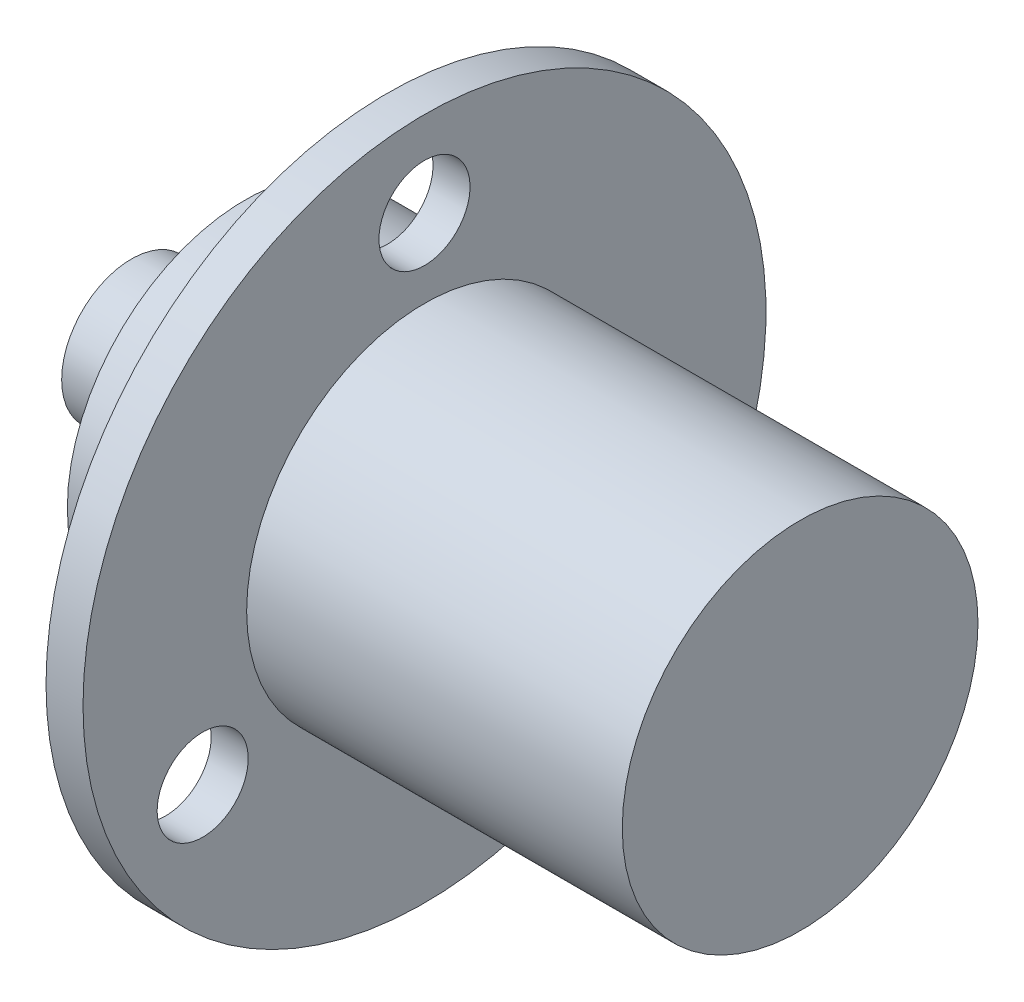
ISO-10303-21;
HEADER;
FILE_DESCRIPTION(('STEP AP214'),'2;1');
FILE_NAME('part.step','',(''),(''),'','','');
FILE_SCHEMA(('AUTOMOTIVE_DESIGN { 1 0 10303 214 1 1 1 1 }'));
ENDSEC;
DATA;
#1=APPLICATION_CONTEXT('core data for automotive mechanical design processes');
#2=APPLICATION_PROTOCOL_DEFINITION('international standard','automotive_design',2000,#1);
#3=PRODUCT_CONTEXT('',#1,'mechanical');
#4=PRODUCT('Part','Part','',(#3));
#5=PRODUCT_RELATED_PRODUCT_CATEGORY('part','',(#4));
#6=PRODUCT_DEFINITION_FORMATION('','',#4);
#7=PRODUCT_DEFINITION_CONTEXT('part definition',#1,'design');
#8=PRODUCT_DEFINITION('design','',#6,#7);
#9=PRODUCT_DEFINITION_SHAPE('','',#8);
#10=(LENGTH_UNIT() NAMED_UNIT(*) SI_UNIT(.MILLI.,.METRE.));
#11=(NAMED_UNIT(*) PLANE_ANGLE_UNIT() SI_UNIT($,.RADIAN.));
#12=(NAMED_UNIT(*) SI_UNIT($,.STERADIAN.) SOLID_ANGLE_UNIT());
#13=UNCERTAINTY_MEASURE_WITH_UNIT(LENGTH_MEASURE(1.E-05),#10,'distance_accuracy_value','');
#14=(GEOMETRIC_REPRESENTATION_CONTEXT(3) GLOBAL_UNCERTAINTY_ASSIGNED_CONTEXT((#13)) GLOBAL_UNIT_ASSIGNED_CONTEXT((#10,
#11,#12)) REPRESENTATION_CONTEXT('',''));
#15=CARTESIAN_POINT('',(0.,0.,0.));
#16=DIRECTION('',(0.,0.,1.));
#17=DIRECTION('',(1.,0.,0.));
#18=AXIS2_PLACEMENT_3D('',#15,#16,#17);
#19=CARTESIAN_POINT('',(-9.,0.,0.));
#20=DIRECTION('',(1.,0.,0.));
#21=DIRECTION('',(0.,0.,-1.));
#22=AXIS2_PLACEMENT_3D('',#19,#20,#21);
#23=PLANE('',#22);
#24=CARTESIAN_POINT('',(-9.,0.,0.));
#25=DIRECTION('',(-1.,0.,0.));
#26=DIRECTION('',(0.,0.,1.));
#27=AXIS2_PLACEMENT_3D('',#24,#25,#26);
#28=CIRCLE('',#27,2.45);
#29=CARTESIAN_POINT('',(-9.,0.,2.45));
#30=VERTEX_POINT('',#29);
#31=EDGE_CURVE('E10',#30,#30,#28,.T.);
#32=ORIENTED_EDGE('',*,*,#31,.T.);
#33=EDGE_LOOP('',(#32));
#34=FACE_BOUND('',#33,.T.);
#35=ADVANCED_FACE('F44',(#34),#23,.F.);
#36=CARTESIAN_POINT('',(-8.07955555555555,0.,0.));
#37=DIRECTION('',(-1.,0.,0.));
#38=DIRECTION('',(0.,0.,1.));
#39=AXIS2_PLACEMENT_3D('',#36,#37,#38);
#40=CYLINDRICAL_SURFACE('',#39,2.45);
#41=ORIENTED_EDGE('',*,*,#31,.F.);
#42=EDGE_LOOP('',(#41));
#43=FACE_BOUND('',#42,.T.);
#44=CARTESIAN_POINT('',(-5.,0.,0.));
#45=DIRECTION('',(-1.,0.,0.));
#46=DIRECTION('',(0.,0.,1.));
#47=AXIS2_PLACEMENT_3D('',#44,#45,#46);
#48=CIRCLE('',#47,2.45);
#49=CARTESIAN_POINT('',(-5.,0.,2.45));
#50=VERTEX_POINT('',#49);
#51=EDGE_CURVE('E55',#50,#50,#48,.T.);
#52=ORIENTED_EDGE('',*,*,#51,.T.);
#53=EDGE_LOOP('',(#52));
#54=FACE_BOUND('',#53,.T.);
#55=ADVANCED_FACE('F134',(#43,#54),#40,.T.);
#56=CARTESIAN_POINT('',(-5.,2.45,0.));
#57=DIRECTION('',(1.,0.,0.));
#58=DIRECTION('',(0.,0.,-1.));
#59=AXIS2_PLACEMENT_3D('',#56,#57,#58);
#60=PLANE('',#59);
#61=ORIENTED_EDGE('',*,*,#51,.F.);
#62=EDGE_LOOP('',(#61));
#63=FACE_BOUND('',#62,.T.);
#64=CARTESIAN_POINT('',(-5.,0.,0.));
#65=DIRECTION('',(-1.,0.,0.));
#66=DIRECTION('',(0.,0.,1.));
#67=AXIS2_PLACEMENT_3D('',#64,#65,#66);
#68=CIRCLE('',#67,6.25);
#69=CARTESIAN_POINT('',(-5.,0.,6.25));
#70=VERTEX_POINT('',#69);
#71=EDGE_CURVE('E60',#70,#70,#68,.T.);
#72=ORIENTED_EDGE('',*,*,#71,.T.);
#73=EDGE_LOOP('',(#72));
#74=FACE_BOUND('',#73,.T.);
#75=ADVANCED_FACE('F94',(#63,#74),#60,.F.);
#76=CARTESIAN_POINT('',(-8.07955555555555,0.,0.));
#77=DIRECTION('',(-1.,0.,0.));
#78=DIRECTION('',(0.,0.,1.));
#79=AXIS2_PLACEMENT_3D('',#76,#77,#78);
#80=CYLINDRICAL_SURFACE('',#79,6.25);
#81=ORIENTED_EDGE('',*,*,#71,.F.);
#82=EDGE_LOOP('',(#81));
#83=FACE_BOUND('',#82,.T.);
#84=CARTESIAN_POINT('',(0.,0.,0.));
#85=DIRECTION('',(-1.,0.,0.));
#86=DIRECTION('',(0.,0.,1.));
#87=AXIS2_PLACEMENT_3D('',#84,#85,#86);
#88=CIRCLE('',#87,6.25);
#89=CARTESIAN_POINT('',(0.,0.,6.25));
#90=VERTEX_POINT('',#89);
#91=EDGE_CURVE('E90',#90,#90,#88,.T.);
#92=ORIENTED_EDGE('',*,*,#91,.T.);
#93=EDGE_LOOP('',(#92));
#94=FACE_BOUND('',#93,.T.);
#95=ADVANCED_FACE('F96',(#83,#94),#80,.T.);
#96=CARTESIAN_POINT('',(0.,6.25,0.));
#97=DIRECTION('',(1.,0.,0.));
#98=DIRECTION('',(0.,0.,-1.));
#99=AXIS2_PLACEMENT_3D('',#96,#97,#98);
#100=PLANE('',#99);
#101=CARTESIAN_POINT('',(0.,9.,0.));
#102=DIRECTION('',(-1.,0.,0.));
#103=DIRECTION('',(0.,0.,1.));
#104=AXIS2_PLACEMENT_3D('',#101,#102,#103);
#105=CIRCLE('',#104,1.6);
#106=CARTESIAN_POINT('',(0.,9.,1.6));
#107=VERTEX_POINT('',#106);
#108=EDGE_CURVE('E65',#107,#107,#105,.T.);
#109=ORIENTED_EDGE('',*,*,#108,.F.);
#110=EDGE_LOOP('',(#109));
#111=FACE_BOUND('',#110,.T.);
#112=CARTESIAN_POINT('',(0.,-4.50000000000004,7.79422863405993));
#113=DIRECTION('',(-1.,0.,0.));
#114=DIRECTION('',(0.,0.,1.));
#115=AXIS2_PLACEMENT_3D('',#112,#113,#114);
#116=CIRCLE('',#115,1.6);
#117=CARTESIAN_POINT('',(0.,-4.50000000000004,9.39422863405993));
#118=VERTEX_POINT('',#117);
#119=EDGE_CURVE('E220',#118,#118,#116,.T.);
#120=ORIENTED_EDGE('',*,*,#119,.F.);
#121=EDGE_LOOP('',(#120));
#122=FACE_BOUND('',#121,.T.);
#123=CARTESIAN_POINT('',(0.,-4.49999999999993,-7.79422863405999));
#124=DIRECTION('',(-1.,0.,0.));
#125=DIRECTION('',(0.,0.,1.));
#126=AXIS2_PLACEMENT_3D('',#123,#124,#125);
#127=CIRCLE('',#126,1.6);
#128=CARTESIAN_POINT('',(0.,-4.49999999999993,-6.19422863405999));
#129=VERTEX_POINT('',#128);
#130=EDGE_CURVE('E83',#129,#129,#127,.T.);
#131=ORIENTED_EDGE('',*,*,#130,.F.);
#132=EDGE_LOOP('',(#131));
#133=FACE_BOUND('',#132,.T.);
#134=ORIENTED_EDGE('',*,*,#91,.F.);
#135=EDGE_LOOP('',(#134));
#136=FACE_BOUND('',#135,.T.);
#137=CARTESIAN_POINT('',(0.,0.,0.));
#138=DIRECTION('',(-1.,0.,0.));
#139=DIRECTION('',(0.,0.,1.));
#140=AXIS2_PLACEMENT_3D('',#137,#138,#139);
#141=CIRCLE('',#140,12.);
#142=CARTESIAN_POINT('',(0.,0.,12.));
#143=VERTEX_POINT('',#142);
#144=EDGE_CURVE('E88',#143,#143,#141,.T.);
#145=ORIENTED_EDGE('',*,*,#144,.T.);
#146=EDGE_LOOP('',(#145));
#147=FACE_BOUND('',#146,.T.);
#148=ADVANCED_FACE('F97',(#111,#122,#133,#136,#147),#100,.F.);
#149=CARTESIAN_POINT('',(-8.07955555555555,0.,0.));
#150=DIRECTION('',(-1.,0.,0.));
#151=DIRECTION('',(0.,0.,1.));
#152=AXIS2_PLACEMENT_3D('',#149,#150,#151);
#153=CYLINDRICAL_SURFACE('',#152,12.);
#154=ORIENTED_EDGE('',*,*,#144,.F.);
#155=EDGE_LOOP('',(#154));
#156=FACE_BOUND('',#155,.T.);
#157=CARTESIAN_POINT('',(1.3,0.,0.));
#158=DIRECTION('',(-1.,0.,0.));
#159=DIRECTION('',(0.,0.,1.));
#160=AXIS2_PLACEMENT_3D('',#157,#158,#159);
#161=CIRCLE('',#160,12.);
#162=CARTESIAN_POINT('',(1.3,0.,12.));
#163=VERTEX_POINT('',#162);
#164=EDGE_CURVE('E77',#163,#163,#161,.T.);
#165=ORIENTED_EDGE('',*,*,#164,.T.);
#166=EDGE_LOOP('',(#165));
#167=FACE_BOUND('',#166,.T.);
#168=ADVANCED_FACE('F104',(#156,#167),#153,.T.);
#169=CARTESIAN_POINT('',(1.3,12.,0.));
#170=DIRECTION('',(-1.,0.,0.));
#171=DIRECTION('',(0.,0.,1.));
#172=AXIS2_PLACEMENT_3D('',#169,#170,#171);
#173=PLANE('',#172);
#174=CARTESIAN_POINT('',(1.3,9.,0.));
#175=DIRECTION('',(-1.,0.,0.));
#176=DIRECTION('',(0.,0.,1.));
#177=AXIS2_PLACEMENT_3D('',#174,#175,#176);
#178=CIRCLE('',#177,1.6);
#179=CARTESIAN_POINT('',(1.3,9.,1.6));
#180=VERTEX_POINT('',#179);
#181=EDGE_CURVE('E48',#180,#180,#178,.T.);
#182=ORIENTED_EDGE('',*,*,#181,.T.);
#183=EDGE_LOOP('',(#182));
#184=FACE_BOUND('',#183,.T.);
#185=CARTESIAN_POINT('',(1.3,-4.50000000000004,7.79422863405993));
#186=DIRECTION('',(-1.,0.,0.));
#187=DIRECTION('',(0.,0.,1.));
#188=AXIS2_PLACEMENT_3D('',#185,#186,#187);
#189=CIRCLE('',#188,1.6);
#190=CARTESIAN_POINT('',(1.3,-4.50000000000004,9.39422863405993));
#191=VERTEX_POINT('',#190);
#192=EDGE_CURVE('E62',#191,#191,#189,.T.);
#193=ORIENTED_EDGE('',*,*,#192,.T.);
#194=EDGE_LOOP('',(#193));
#195=FACE_BOUND('',#194,.T.);
#196=CARTESIAN_POINT('',(1.3,-4.49999999999993,-7.79422863405999));
#197=DIRECTION('',(-1.,0.,0.));
#198=DIRECTION('',(0.,0.,1.));
#199=AXIS2_PLACEMENT_3D('',#196,#197,#198);
#200=CIRCLE('',#199,1.6);
#201=CARTESIAN_POINT('',(1.3,-4.49999999999993,-6.19422863405999));
#202=VERTEX_POINT('',#201);
#203=EDGE_CURVE('E63',#202,#202,#200,.T.);
#204=ORIENTED_EDGE('',*,*,#203,.T.);
#205=EDGE_LOOP('',(#204));
#206=FACE_BOUND('',#205,.T.);
#207=ORIENTED_EDGE('',*,*,#164,.F.);
#208=EDGE_LOOP('',(#207));
#209=FACE_BOUND('',#208,.T.);
#210=CARTESIAN_POINT('',(1.3,0.,0.));
#211=DIRECTION('',(-1.,0.,0.));
#212=DIRECTION('',(0.,0.,1.));
#213=AXIS2_PLACEMENT_3D('',#210,#211,#212);
#214=CIRCLE('',#213,6.25);
#215=CARTESIAN_POINT('',(1.3,0.,6.25));
#216=VERTEX_POINT('',#215);
#217=EDGE_CURVE('E71',#216,#216,#214,.T.);
#218=ORIENTED_EDGE('',*,*,#217,.T.);
#219=EDGE_LOOP('',(#218));
#220=FACE_BOUND('',#219,.T.);
#221=ADVANCED_FACE('F115',(#184,#195,#206,#209,#220),#173,.F.);
#222=CARTESIAN_POINT('',(-8.07955555555555,0.,0.));
#223=DIRECTION('',(-1.,0.,0.));
#224=DIRECTION('',(0.,0.,1.));
#225=AXIS2_PLACEMENT_3D('',#222,#223,#224);
#226=CYLINDRICAL_SURFACE('',#225,6.25);
#227=ORIENTED_EDGE('',*,*,#217,.F.);
#228=EDGE_LOOP('',(#227));
#229=FACE_BOUND('',#228,.T.);
#230=CARTESIAN_POINT('',(14.5,0.,0.));
#231=DIRECTION('',(-1.,0.,0.));
#232=DIRECTION('',(0.,0.,1.));
#233=AXIS2_PLACEMENT_3D('',#230,#231,#232);
#234=CIRCLE('',#233,6.25);
#235=CARTESIAN_POINT('',(14.5,0.,6.25));
#236=VERTEX_POINT('',#235);
#237=EDGE_CURVE('E67',#236,#236,#234,.T.);
#238=ORIENTED_EDGE('',*,*,#237,.T.);
#239=EDGE_LOOP('',(#238));
#240=FACE_BOUND('',#239,.T.);
#241=ADVANCED_FACE('F117',(#229,#240),#226,.T.);
#242=CARTESIAN_POINT('',(14.5,6.25,0.));
#243=DIRECTION('',(-1.,0.,0.));
#244=DIRECTION('',(0.,0.,1.));
#245=AXIS2_PLACEMENT_3D('',#242,#243,#244);
#246=PLANE('',#245);
#247=ORIENTED_EDGE('',*,*,#237,.F.);
#248=EDGE_LOOP('',(#247));
#249=FACE_BOUND('',#248,.T.);
#250=ADVANCED_FACE('F121',(#249),#246,.F.);
#251=CARTESIAN_POINT('',(10.,-4.49999999999993,-7.79422863405999));
#252=DIRECTION('',(-1.,0.,0.));
#253=DIRECTION('',(0.,0.,1.));
#254=AXIS2_PLACEMENT_3D('',#251,#252,#253);
#255=CYLINDRICAL_SURFACE('',#254,1.6);
#256=ORIENTED_EDGE('',*,*,#130,.T.);
#257=EDGE_LOOP('',(#256));
#258=FACE_BOUND('',#257,.T.);
#259=ORIENTED_EDGE('',*,*,#203,.F.);
#260=EDGE_LOOP('',(#259));
#261=FACE_BOUND('',#260,.T.);
#262=ADVANCED_FACE('F126',(#258,#261),#255,.F.);
#263=CARTESIAN_POINT('',(10.,-4.50000000000004,7.79422863405993));
#264=DIRECTION('',(-1.,0.,0.));
#265=DIRECTION('',(0.,0.,1.));
#266=AXIS2_PLACEMENT_3D('',#263,#264,#265);
#267=CYLINDRICAL_SURFACE('',#266,1.6);
#268=ORIENTED_EDGE('',*,*,#119,.T.);
#269=EDGE_LOOP('',(#268));
#270=FACE_BOUND('',#269,.T.);
#271=ORIENTED_EDGE('',*,*,#192,.F.);
#272=EDGE_LOOP('',(#271));
#273=FACE_BOUND('',#272,.T.);
#274=ADVANCED_FACE('F193',(#270,#273),#267,.F.);
#275=CARTESIAN_POINT('',(10.,9.,0.));
#276=DIRECTION('',(-1.,0.,0.));
#277=DIRECTION('',(0.,0.,1.));
#278=AXIS2_PLACEMENT_3D('',#275,#276,#277);
#279=CYLINDRICAL_SURFACE('',#278,1.6);
#280=ORIENTED_EDGE('',*,*,#108,.T.);
#281=EDGE_LOOP('',(#280));
#282=FACE_BOUND('',#281,.T.);
#283=ORIENTED_EDGE('',*,*,#181,.F.);
#284=EDGE_LOOP('',(#283));
#285=FACE_BOUND('',#284,.T.);
#286=ADVANCED_FACE('F203',(#282,#285),#279,.F.);
#287=CLOSED_SHELL('',(#35,#55,#75,#95,#148,#168,#221,#241,#250,#262,#274,#286));
#288=MANIFOLD_SOLID_BREP('B2',#287);
#289=ADVANCED_BREP_SHAPE_REPRESENTATION('',(#18,#288),#14);
#290=SHAPE_DEFINITION_REPRESENTATION(#9,#289);
ENDSEC;
END-ISO-10303-21;
